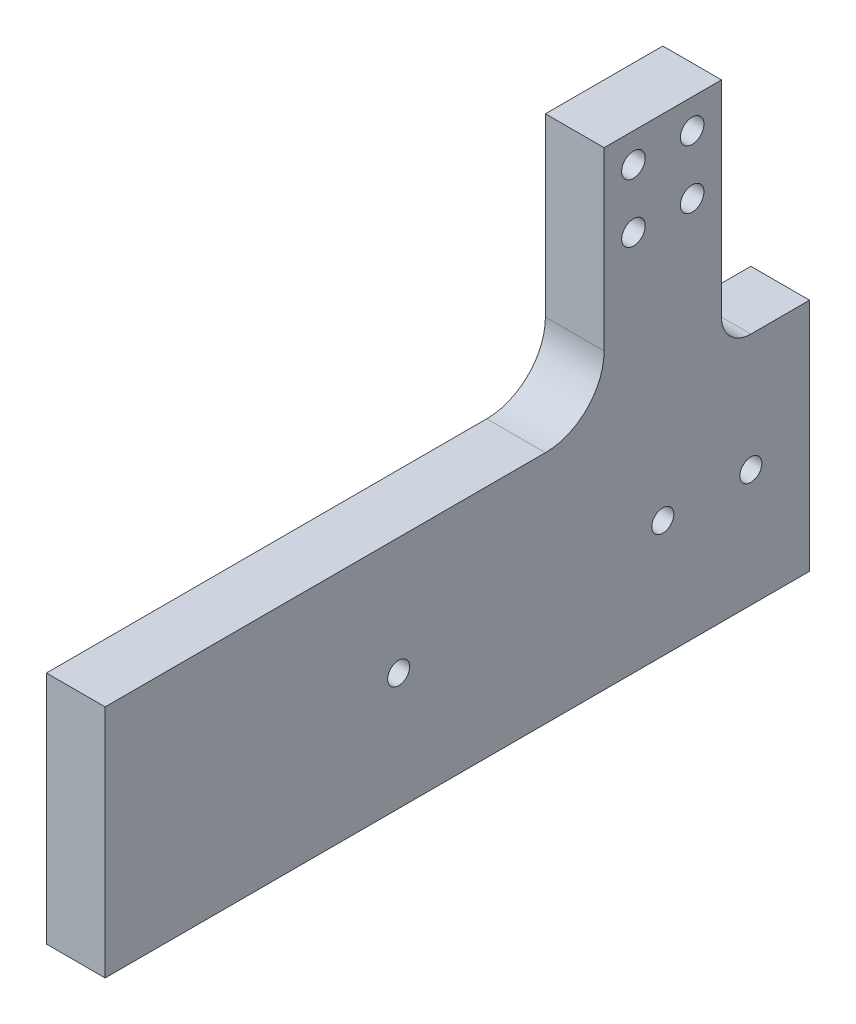
ISO-10303-21;
HEADER;
FILE_DESCRIPTION(('STEP AP214'),'2;1');
FILE_NAME('part.step','',(''),(''),'','','');
FILE_SCHEMA(('AUTOMOTIVE_DESIGN { 1 0 10303 214 1 1 1 1 }'));
ENDSEC;
DATA;
#1=APPLICATION_CONTEXT('core data for automotive mechanical design processes');
#2=APPLICATION_PROTOCOL_DEFINITION('international standard','automotive_design',2000,#1);
#3=PRODUCT_CONTEXT('',#1,'mechanical');
#4=PRODUCT('Part','Part','',(#3));
#5=PRODUCT_RELATED_PRODUCT_CATEGORY('part','',(#4));
#6=PRODUCT_DEFINITION_FORMATION('','',#4);
#7=PRODUCT_DEFINITION_CONTEXT('part definition',#1,'design');
#8=PRODUCT_DEFINITION('design','',#6,#7);
#9=PRODUCT_DEFINITION_SHAPE('','',#8);
#10=(LENGTH_UNIT() NAMED_UNIT(*) SI_UNIT(.MILLI.,.METRE.));
#11=(NAMED_UNIT(*) PLANE_ANGLE_UNIT() SI_UNIT($,.RADIAN.));
#12=(NAMED_UNIT(*) SI_UNIT($,.STERADIAN.) SOLID_ANGLE_UNIT());
#13=UNCERTAINTY_MEASURE_WITH_UNIT(LENGTH_MEASURE(1.E-05),#10,'distance_accuracy_value','');
#14=(GEOMETRIC_REPRESENTATION_CONTEXT(3) GLOBAL_UNCERTAINTY_ASSIGNED_CONTEXT((#13)) GLOBAL_UNIT_ASSIGNED_CONTEXT((#10,
#11,#12)) REPRESENTATION_CONTEXT('',''));
#15=CARTESIAN_POINT('',(0.,0.,0.));
#16=DIRECTION('',(0.,0.,1.));
#17=DIRECTION('',(1.,0.,0.));
#18=AXIS2_PLACEMENT_3D('',#15,#16,#17);
#19=CARTESIAN_POINT('',(12.7,0.,0.));
#20=DIRECTION('',(1.,0.,0.));
#21=DIRECTION('',(0.,0.,-1.));
#22=AXIS2_PLACEMENT_3D('',#19,#20,#21);
#23=PLANE('',#22);
#24=CARTESIAN_POINT('',(12.7,95.25,38.1));
#25=DIRECTION('',(1.,0.,0.));
#26=DIRECTION('',(0.,0.,-1.));
#27=AXIS2_PLACEMENT_3D('',#24,#25,#26);
#28=CIRCLE('',#27,2.55270000000001);
#29=CARTESIAN_POINT('',(12.7,95.25,35.5473));
#30=VERTEX_POINT('',#29);
#31=EDGE_CURVE('E440',#30,#30,#28,.T.);
#32=ORIENTED_EDGE('',*,*,#31,.F.);
#33=EDGE_LOOP('',(#32));
#34=FACE_BOUND('',#33,.T.);
#35=CARTESIAN_POINT('',(12.7,95.25,25.4));
#36=DIRECTION('',(1.,0.,0.));
#37=DIRECTION('',(0.,0.,-1.));
#38=AXIS2_PLACEMENT_3D('',#35,#36,#37);
#39=CIRCLE('',#38,2.55270000000001);
#40=CARTESIAN_POINT('',(12.7,95.25,22.8473));
#41=VERTEX_POINT('',#40);
#42=EDGE_CURVE('E444',#41,#41,#39,.T.);
#43=ORIENTED_EDGE('',*,*,#42,.F.);
#44=EDGE_LOOP('',(#43));
#45=FACE_BOUND('',#44,.T.);
#46=CARTESIAN_POINT('',(12.7,82.55,25.4));
#47=DIRECTION('',(1.,0.,0.));
#48=DIRECTION('',(0.,0.,-1.));
#49=AXIS2_PLACEMENT_3D('',#46,#47,#48);
#50=CIRCLE('',#49,2.55270000000001);
#51=CARTESIAN_POINT('',(12.7,82.55,22.8473));
#52=VERTEX_POINT('',#51);
#53=EDGE_CURVE('E454',#52,#52,#50,.T.);
#54=ORIENTED_EDGE('',*,*,#53,.F.);
#55=EDGE_LOOP('',(#54));
#56=FACE_BOUND('',#55,.T.);
#57=CARTESIAN_POINT('',(12.7,82.55,38.1));
#58=DIRECTION('',(1.,0.,0.));
#59=DIRECTION('',(0.,0.,-1.));
#60=AXIS2_PLACEMENT_3D('',#57,#58,#59);
#61=CIRCLE('',#60,2.55270000000001);
#62=CARTESIAN_POINT('',(12.7,82.55,35.5473));
#63=VERTEX_POINT('',#62);
#64=EDGE_CURVE('E462',#63,#63,#61,.T.);
#65=ORIENTED_EDGE('',*,*,#64,.F.);
#66=EDGE_LOOP('',(#65));
#67=FACE_BOUND('',#66,.T.);
#68=CARTESIAN_POINT('',(12.7,25.4,31.75));
#69=DIRECTION('',(1.,0.,0.));
#70=DIRECTION('',(0.,0.,-1.));
#71=AXIS2_PLACEMENT_3D('',#68,#69,#70);
#72=CIRCLE('',#71,2.38125000000001);
#73=CARTESIAN_POINT('',(12.7,25.4,29.36875));
#74=VERTEX_POINT('',#73);
#75=EDGE_CURVE('E255',#74,#74,#72,.T.);
#76=ORIENTED_EDGE('',*,*,#75,.F.);
#77=EDGE_LOOP('',(#76));
#78=FACE_BOUND('',#77,.T.);
#79=DIRECTION('',(0.,1.,0.));
#80=VECTOR('',#79,1.);
#81=CARTESIAN_POINT('',(12.7,50.8,0.));
#82=LINE('',#81,#80);
#83=CARTESIAN_POINT('',(12.7,0.,0.));
#84=VERTEX_POINT('',#83);
#85=CARTESIAN_POINT('',(12.7,50.8,0.));
#86=VERTEX_POINT('',#85);
#87=EDGE_CURVE('E125',#84,#86,#82,.T.);
#88=ORIENTED_EDGE('',*,*,#87,.T.);
#89=DIRECTION('',(0.,0.,1.));
#90=VECTOR('',#89,1.);
#91=CARTESIAN_POINT('',(12.7,50.8,19.05));
#92=LINE('',#91,#90);
#93=CARTESIAN_POINT('',(12.7,50.8,12.7));
#94=VERTEX_POINT('',#93);
#95=EDGE_CURVE('E115',#86,#94,#92,.T.);
#96=ORIENTED_EDGE('',*,*,#95,.T.);
#97=CARTESIAN_POINT('',(12.7,57.15,12.7));
#98=DIRECTION('',(1.,0.,0.));
#99=DIRECTION('',(0.,0.,-1.));
#100=AXIS2_PLACEMENT_3D('',#97,#98,#99);
#101=CIRCLE('',#100,6.35);
#102=CARTESIAN_POINT('',(12.7,57.15,19.05));
#103=VERTEX_POINT('',#102);
#104=EDGE_CURVE('E11',#94,#103,#101,.F.);
#105=ORIENTED_EDGE('',*,*,#104,.T.);
#106=DIRECTION('',(0.,1.,0.));
#107=VECTOR('',#106,1.);
#108=CARTESIAN_POINT('',(12.7,101.6,19.05));
#109=LINE('',#108,#107);
#110=CARTESIAN_POINT('',(12.7,101.6,19.05));
#111=VERTEX_POINT('',#110);
#112=EDGE_CURVE('E124',#103,#111,#109,.T.);
#113=ORIENTED_EDGE('',*,*,#112,.T.);
#114=DIRECTION('',(0.,0.,1.));
#115=VECTOR('',#114,1.);
#116=CARTESIAN_POINT('',(12.7,101.6,19.05));
#117=LINE('',#116,#115);
#118=CARTESIAN_POINT('',(12.7,101.6,44.45));
#119=VERTEX_POINT('',#118);
#120=EDGE_CURVE('E240',#111,#119,#117,.T.);
#121=ORIENTED_EDGE('',*,*,#120,.T.);
#122=DIRECTION('',(0.,-1.,0.));
#123=VECTOR('',#122,1.);
#124=CARTESIAN_POINT('',(12.7,101.6,44.45));
#125=LINE('',#124,#123);
#126=CARTESIAN_POINT('',(12.7,63.5,44.45));
#127=VERTEX_POINT('',#126);
#128=EDGE_CURVE('E219',#119,#127,#125,.T.);
#129=ORIENTED_EDGE('',*,*,#128,.T.);
#130=CARTESIAN_POINT('',(12.7,63.5,57.15));
#131=DIRECTION('',(1.,0.,0.));
#132=DIRECTION('',(0.,0.,-1.));
#133=AXIS2_PLACEMENT_3D('',#130,#131,#132);
#134=CIRCLE('',#133,12.7);
#135=CARTESIAN_POINT('',(12.7,50.8,57.15));
#136=VERTEX_POINT('',#135);
#137=EDGE_CURVE('E159',#127,#136,#134,.F.);
#138=ORIENTED_EDGE('',*,*,#137,.T.);
#139=DIRECTION('',(0.,0.,1.));
#140=VECTOR('',#139,1.);
#141=CARTESIAN_POINT('',(12.7,50.8,44.45));
#142=LINE('',#141,#140);
#143=CARTESIAN_POINT('',(12.7,50.8,152.4));
#144=VERTEX_POINT('',#143);
#145=EDGE_CURVE('E232',#136,#144,#142,.T.);
#146=ORIENTED_EDGE('',*,*,#145,.T.);
#147=DIRECTION('',(0.,-1.,0.));
#148=VECTOR('',#147,1.);
#149=CARTESIAN_POINT('',(12.7,50.8,152.4));
#150=LINE('',#149,#148);
#151=CARTESIAN_POINT('',(12.7,0.,152.4));
#152=VERTEX_POINT('',#151);
#153=EDGE_CURVE('E235',#144,#152,#150,.T.);
#154=ORIENTED_EDGE('',*,*,#153,.T.);
#155=DIRECTION('',(0.,0.,-1.));
#156=VECTOR('',#155,1.);
#157=CARTESIAN_POINT('',(12.7,0.,152.4));
#158=LINE('',#157,#156);
#159=EDGE_CURVE('E130',#152,#84,#158,.T.);
#160=ORIENTED_EDGE('',*,*,#159,.T.);
#161=EDGE_LOOP('',(#88,#96,#105,#113,#121,#129,#138,#146,#154,#160));
#162=FACE_BOUND('',#161,.T.);
#163=CARTESIAN_POINT('',(12.7,25.4,88.9));
#164=DIRECTION('',(1.,0.,0.));
#165=DIRECTION('',(0.,0.,-1.));
#166=AXIS2_PLACEMENT_3D('',#163,#164,#165);
#167=CIRCLE('',#166,2.38125000000001);
#168=CARTESIAN_POINT('',(12.7,25.4,86.51875));
#169=VERTEX_POINT('',#168);
#170=EDGE_CURVE('E246',#169,#169,#167,.T.);
#171=ORIENTED_EDGE('',*,*,#170,.F.);
#172=EDGE_LOOP('',(#171));
#173=FACE_BOUND('',#172,.T.);
#174=CARTESIAN_POINT('',(12.7,25.4,12.7));
#175=DIRECTION('',(1.,0.,0.));
#176=DIRECTION('',(0.,0.,-1.));
#177=AXIS2_PLACEMENT_3D('',#174,#175,#176);
#178=CIRCLE('',#177,2.38125000000001);
#179=CARTESIAN_POINT('',(12.7,25.4,10.31875));
#180=VERTEX_POINT('',#179);
#181=EDGE_CURVE('E471',#180,#180,#178,.T.);
#182=ORIENTED_EDGE('',*,*,#181,.F.);
#183=EDGE_LOOP('',(#182));
#184=FACE_BOUND('',#183,.T.);
#185=ADVANCED_FACE('F41',(#34,#45,#56,#67,#78,#162,#173,#184),#23,.T.);
#186=CARTESIAN_POINT('',(0.,0.,0.));
#187=DIRECTION('',(1.,0.,0.));
#188=DIRECTION('',(0.,0.,-1.));
#189=AXIS2_PLACEMENT_3D('',#186,#187,#188);
#190=PLANE('',#189);
#191=CARTESIAN_POINT('',(0.,95.25,38.1));
#192=DIRECTION('',(1.,0.,0.));
#193=DIRECTION('',(0.,0.,-1.));
#194=AXIS2_PLACEMENT_3D('',#191,#192,#193);
#195=CIRCLE('',#194,2.55269999999999);
#196=CARTESIAN_POINT('',(0.,95.25,35.5473));
#197=VERTEX_POINT('',#196);
#198=EDGE_CURVE('E438',#197,#197,#195,.T.);
#199=ORIENTED_EDGE('',*,*,#198,.T.);
#200=EDGE_LOOP('',(#199));
#201=FACE_BOUND('',#200,.T.);
#202=CARTESIAN_POINT('',(0.,95.25,25.4));
#203=DIRECTION('',(1.,0.,0.));
#204=DIRECTION('',(0.,0.,-1.));
#205=AXIS2_PLACEMENT_3D('',#202,#203,#204);
#206=CIRCLE('',#205,2.55269999999999);
#207=CARTESIAN_POINT('',(0.,95.25,22.8473));
#208=VERTEX_POINT('',#207);
#209=EDGE_CURVE('E450',#208,#208,#206,.T.);
#210=ORIENTED_EDGE('',*,*,#209,.T.);
#211=EDGE_LOOP('',(#210));
#212=FACE_BOUND('',#211,.T.);
#213=CARTESIAN_POINT('',(0.,82.55,25.4));
#214=DIRECTION('',(1.,0.,0.));
#215=DIRECTION('',(0.,0.,-1.));
#216=AXIS2_PLACEMENT_3D('',#213,#214,#215);
#217=CIRCLE('',#216,2.55269999999999);
#218=CARTESIAN_POINT('',(0.,82.55,22.8473));
#219=VERTEX_POINT('',#218);
#220=EDGE_CURVE('E458',#219,#219,#217,.T.);
#221=ORIENTED_EDGE('',*,*,#220,.T.);
#222=EDGE_LOOP('',(#221));
#223=FACE_BOUND('',#222,.T.);
#224=CARTESIAN_POINT('',(0.,82.55,38.1));
#225=DIRECTION('',(1.,0.,0.));
#226=DIRECTION('',(0.,0.,-1.));
#227=AXIS2_PLACEMENT_3D('',#224,#225,#226);
#228=CIRCLE('',#227,2.55269999999999);
#229=CARTESIAN_POINT('',(0.,82.55,35.5473));
#230=VERTEX_POINT('',#229);
#231=EDGE_CURVE('E466',#230,#230,#228,.T.);
#232=ORIENTED_EDGE('',*,*,#231,.T.);
#233=EDGE_LOOP('',(#232));
#234=FACE_BOUND('',#233,.T.);
#235=DIRECTION('',(0.,1.,0.));
#236=VECTOR('',#235,1.);
#237=CARTESIAN_POINT('',(0.,50.8,0.));
#238=LINE('',#237,#236);
#239=CARTESIAN_POINT('',(0.,0.,0.));
#240=VERTEX_POINT('',#239);
#241=CARTESIAN_POINT('',(0.,50.8,0.));
#242=VERTEX_POINT('',#241);
#243=EDGE_CURVE('E139',#240,#242,#238,.T.);
#244=ORIENTED_EDGE('',*,*,#243,.F.);
#245=DIRECTION('',(0.,0.,-1.));
#246=VECTOR('',#245,1.);
#247=CARTESIAN_POINT('',(0.,0.,152.4));
#248=LINE('',#247,#246);
#249=CARTESIAN_POINT('',(0.,0.,152.4));
#250=VERTEX_POINT('',#249);
#251=EDGE_CURVE('E135',#250,#240,#248,.T.);
#252=ORIENTED_EDGE('',*,*,#251,.F.);
#253=DIRECTION('',(0.,-1.,0.));
#254=VECTOR('',#253,1.);
#255=CARTESIAN_POINT('',(0.,50.8,152.4));
#256=LINE('',#255,#254);
#257=CARTESIAN_POINT('',(0.,50.8,152.4));
#258=VERTEX_POINT('',#257);
#259=EDGE_CURVE('E196',#258,#250,#256,.T.);
#260=ORIENTED_EDGE('',*,*,#259,.F.);
#261=DIRECTION('',(0.,0.,1.));
#262=VECTOR('',#261,1.);
#263=CARTESIAN_POINT('',(0.,50.8,44.45));
#264=LINE('',#263,#262);
#265=CARTESIAN_POINT('',(0.,50.8,57.15));
#266=VERTEX_POINT('',#265);
#267=EDGE_CURVE('E193',#266,#258,#264,.T.);
#268=ORIENTED_EDGE('',*,*,#267,.F.);
#269=CARTESIAN_POINT('',(0.,63.5,57.15));
#270=DIRECTION('',(1.,0.,0.));
#271=DIRECTION('',(0.,0.,-1.));
#272=AXIS2_PLACEMENT_3D('',#269,#270,#271);
#273=CIRCLE('',#272,12.7);
#274=CARTESIAN_POINT('',(0.,63.5,44.45));
#275=VERTEX_POINT('',#274);
#276=EDGE_CURVE('E156',#266,#275,#273,.T.);
#277=ORIENTED_EDGE('',*,*,#276,.T.);
#278=DIRECTION('',(0.,-1.,0.));
#279=VECTOR('',#278,1.);
#280=CARTESIAN_POINT('',(0.,101.6,44.45));
#281=LINE('',#280,#279);
#282=CARTESIAN_POINT('',(0.,101.6,44.45));
#283=VERTEX_POINT('',#282);
#284=EDGE_CURVE('E185',#283,#275,#281,.T.);
#285=ORIENTED_EDGE('',*,*,#284,.F.);
#286=DIRECTION('',(0.,0.,1.));
#287=VECTOR('',#286,1.);
#288=CARTESIAN_POINT('',(0.,101.6,19.05));
#289=LINE('',#288,#287);
#290=CARTESIAN_POINT('',(0.,101.6,19.05));
#291=VERTEX_POINT('',#290);
#292=EDGE_CURVE('E179',#291,#283,#289,.T.);
#293=ORIENTED_EDGE('',*,*,#292,.F.);
#294=DIRECTION('',(0.,1.,0.));
#295=VECTOR('',#294,1.);
#296=CARTESIAN_POINT('',(0.,101.6,19.05));
#297=LINE('',#296,#295);
#298=CARTESIAN_POINT('',(0.,57.15,19.05));
#299=VERTEX_POINT('',#298);
#300=EDGE_CURVE('E173',#299,#291,#297,.T.);
#301=ORIENTED_EDGE('',*,*,#300,.F.);
#302=CARTESIAN_POINT('',(0.,57.15,12.7));
#303=DIRECTION('',(1.,0.,0.));
#304=DIRECTION('',(0.,0.,-1.));
#305=AXIS2_PLACEMENT_3D('',#302,#303,#304);
#306=CIRCLE('',#305,6.35);
#307=CARTESIAN_POINT('',(0.,50.8,12.7));
#308=VERTEX_POINT('',#307);
#309=EDGE_CURVE('E50',#299,#308,#306,.T.);
#310=ORIENTED_EDGE('',*,*,#309,.T.);
#311=DIRECTION('',(0.,0.,1.));
#312=VECTOR('',#311,1.);
#313=CARTESIAN_POINT('',(0.,50.8,19.05));
#314=LINE('',#313,#312);
#315=EDGE_CURVE('E181',#242,#308,#314,.T.);
#316=ORIENTED_EDGE('',*,*,#315,.F.);
#317=EDGE_LOOP('',(#244,#252,#260,#268,#277,#285,#293,#301,#310,#316));
#318=FACE_BOUND('',#317,.T.);
#319=CARTESIAN_POINT('',(0.,25.4,88.9));
#320=DIRECTION('',(1.,0.,0.));
#321=DIRECTION('',(0.,0.,-1.));
#322=AXIS2_PLACEMENT_3D('',#319,#320,#321);
#323=CIRCLE('',#322,2.38125000000001);
#324=CARTESIAN_POINT('',(0.,25.4,86.51875));
#325=VERTEX_POINT('',#324);
#326=EDGE_CURVE('E249',#325,#325,#323,.T.);
#327=ORIENTED_EDGE('',*,*,#326,.T.);
#328=EDGE_LOOP('',(#327));
#329=FACE_BOUND('',#328,.T.);
#330=CARTESIAN_POINT('',(0.,25.4,31.75));
#331=DIRECTION('',(1.,0.,0.));
#332=DIRECTION('',(0.,0.,-1.));
#333=AXIS2_PLACEMENT_3D('',#330,#331,#332);
#334=CIRCLE('',#333,2.38125000000001);
#335=CARTESIAN_POINT('',(0.,25.4,29.36875));
#336=VERTEX_POINT('',#335);
#337=EDGE_CURVE('E258',#336,#336,#334,.T.);
#338=ORIENTED_EDGE('',*,*,#337,.T.);
#339=EDGE_LOOP('',(#338));
#340=FACE_BOUND('',#339,.T.);
#341=CARTESIAN_POINT('',(0.,25.4,12.7));
#342=DIRECTION('',(1.,0.,0.));
#343=DIRECTION('',(0.,0.,-1.));
#344=AXIS2_PLACEMENT_3D('',#341,#342,#343);
#345=CIRCLE('',#344,2.38125000000001);
#346=CARTESIAN_POINT('',(0.,25.4,10.31875));
#347=VERTEX_POINT('',#346);
#348=EDGE_CURVE('E470',#347,#347,#345,.T.);
#349=ORIENTED_EDGE('',*,*,#348,.T.);
#350=EDGE_LOOP('',(#349));
#351=FACE_BOUND('',#350,.T.);
#352=ADVANCED_FACE('F176',(#201,#212,#223,#234,#318,#329,#340,#351),#190,.F.);
#353=CARTESIAN_POINT('',(12.7,50.8,0.));
#354=DIRECTION('',(0.,0.,1.));
#355=DIRECTION('',(1.,0.,0.));
#356=AXIS2_PLACEMENT_3D('',#353,#354,#355);
#357=PLANE('',#356);
#358=ORIENTED_EDGE('',*,*,#243,.T.);
#359=DIRECTION('',(-1.,0.,0.));
#360=VECTOR('',#359,1.);
#361=CARTESIAN_POINT('',(12.7,50.8,0.));
#362=LINE('',#361,#360);
#363=EDGE_CURVE('E119',#86,#242,#362,.T.);
#364=ORIENTED_EDGE('',*,*,#363,.F.);
#365=ORIENTED_EDGE('',*,*,#87,.F.);
#366=DIRECTION('',(-1.,0.,0.));
#367=VECTOR('',#366,1.);
#368=CARTESIAN_POINT('',(12.7,0.,0.));
#369=LINE('',#368,#367);
#370=EDGE_CURVE('E201',#84,#240,#369,.T.);
#371=ORIENTED_EDGE('',*,*,#370,.T.);
#372=EDGE_LOOP('',(#358,#364,#365,#371));
#373=FACE_BOUND('',#372,.T.);
#374=ADVANCED_FACE('F137',(#373),#357,.F.);
#375=CARTESIAN_POINT('',(12.7,50.8,19.05));
#376=DIRECTION('',(0.,-1.,0.));
#377=DIRECTION('',(0.,0.,-1.));
#378=AXIS2_PLACEMENT_3D('',#375,#376,#377);
#379=PLANE('',#378);
#380=ORIENTED_EDGE('',*,*,#315,.T.);
#381=DIRECTION('',(-1.,0.,0.));
#382=VECTOR('',#381,1.);
#383=CARTESIAN_POINT('',(12.7,50.8,12.7));
#384=LINE('',#383,#382);
#385=EDGE_CURVE('E57',#308,#94,#384,.F.);
#386=ORIENTED_EDGE('',*,*,#385,.T.);
#387=ORIENTED_EDGE('',*,*,#95,.F.);
#388=ORIENTED_EDGE('',*,*,#363,.T.);
#389=EDGE_LOOP('',(#380,#386,#387,#388));
#390=FACE_BOUND('',#389,.T.);
#391=ADVANCED_FACE('F117',(#390),#379,.F.);
#392=CARTESIAN_POINT('',(12.7,101.6,19.05));
#393=DIRECTION('',(0.,0.,1.));
#394=DIRECTION('',(0.,-1.,0.));
#395=AXIS2_PLACEMENT_3D('',#392,#393,#394);
#396=PLANE('',#395);
#397=ORIENTED_EDGE('',*,*,#112,.F.);
#398=DIRECTION('',(-1.,0.,0.));
#399=VECTOR('',#398,1.);
#400=CARTESIAN_POINT('',(0.,57.15,19.05));
#401=LINE('',#400,#399);
#402=EDGE_CURVE('E162',#103,#299,#401,.T.);
#403=ORIENTED_EDGE('',*,*,#402,.T.);
#404=ORIENTED_EDGE('',*,*,#300,.T.);
#405=DIRECTION('',(-1.,0.,0.));
#406=VECTOR('',#405,1.);
#407=CARTESIAN_POINT('',(12.7,101.6,19.05));
#408=LINE('',#407,#406);
#409=EDGE_CURVE('E142',#111,#291,#408,.T.);
#410=ORIENTED_EDGE('',*,*,#409,.F.);
#411=EDGE_LOOP('',(#397,#403,#404,#410));
#412=FACE_BOUND('',#411,.T.);
#413=ADVANCED_FACE('F171',(#412),#396,.F.);
#414=CARTESIAN_POINT('',(12.7,101.6,19.05));
#415=DIRECTION('',(0.,-1.,0.));
#416=DIRECTION('',(0.,0.,-1.));
#417=AXIS2_PLACEMENT_3D('',#414,#415,#416);
#418=PLANE('',#417);
#419=ORIENTED_EDGE('',*,*,#292,.T.);
#420=DIRECTION('',(-1.,0.,0.));
#421=VECTOR('',#420,1.);
#422=CARTESIAN_POINT('',(12.7,101.6,44.45));
#423=LINE('',#422,#421);
#424=EDGE_CURVE('E150',#119,#283,#423,.T.);
#425=ORIENTED_EDGE('',*,*,#424,.F.);
#426=ORIENTED_EDGE('',*,*,#120,.F.);
#427=ORIENTED_EDGE('',*,*,#409,.T.);
#428=EDGE_LOOP('',(#419,#425,#426,#427));
#429=FACE_BOUND('',#428,.T.);
#430=ADVANCED_FACE('F263',(#429),#418,.F.);
#431=CARTESIAN_POINT('',(12.7,101.6,44.45));
#432=DIRECTION('',(0.,0.,-1.));
#433=DIRECTION('',(-1.,0.,0.));
#434=AXIS2_PLACEMENT_3D('',#431,#432,#433);
#435=PLANE('',#434);
#436=ORIENTED_EDGE('',*,*,#284,.T.);
#437=DIRECTION('',(-1.,0.,0.));
#438=VECTOR('',#437,1.);
#439=CARTESIAN_POINT('',(12.7,63.5,44.45));
#440=LINE('',#439,#438);
#441=EDGE_CURVE('E147',#275,#127,#440,.F.);
#442=ORIENTED_EDGE('',*,*,#441,.T.);
#443=ORIENTED_EDGE('',*,*,#128,.F.);
#444=ORIENTED_EDGE('',*,*,#424,.T.);
#445=EDGE_LOOP('',(#436,#442,#443,#444));
#446=FACE_BOUND('',#445,.T.);
#447=ADVANCED_FACE('F216',(#446),#435,.F.);
#448=CARTESIAN_POINT('',(12.7,50.8,44.45));
#449=DIRECTION('',(0.,-1.,0.));
#450=DIRECTION('',(0.,0.,-1.));
#451=AXIS2_PLACEMENT_3D('',#448,#449,#450);
#452=PLANE('',#451);
#453=ORIENTED_EDGE('',*,*,#145,.F.);
#454=DIRECTION('',(-1.,0.,0.));
#455=VECTOR('',#454,1.);
#456=CARTESIAN_POINT('',(0.,50.8,57.15));
#457=LINE('',#456,#455);
#458=EDGE_CURVE('E141',#136,#266,#457,.T.);
#459=ORIENTED_EDGE('',*,*,#458,.T.);
#460=ORIENTED_EDGE('',*,*,#267,.T.);
#461=DIRECTION('',(-1.,0.,0.));
#462=VECTOR('',#461,1.);
#463=CARTESIAN_POINT('',(12.7,50.8,152.4));
#464=LINE('',#463,#462);
#465=EDGE_CURVE('E208',#144,#258,#464,.T.);
#466=ORIENTED_EDGE('',*,*,#465,.F.);
#467=EDGE_LOOP('',(#453,#459,#460,#466));
#468=FACE_BOUND('',#467,.T.);
#469=ADVANCED_FACE('F230',(#468),#452,.F.);
#470=CARTESIAN_POINT('',(12.7,50.8,152.4));
#471=DIRECTION('',(0.,0.,-1.));
#472=DIRECTION('',(-1.,0.,0.));
#473=AXIS2_PLACEMENT_3D('',#470,#471,#472);
#474=PLANE('',#473);
#475=ORIENTED_EDGE('',*,*,#259,.T.);
#476=DIRECTION('',(-1.,0.,0.));
#477=VECTOR('',#476,1.);
#478=CARTESIAN_POINT('',(12.7,0.,152.4));
#479=LINE('',#478,#477);
#480=EDGE_CURVE('E204',#152,#250,#479,.T.);
#481=ORIENTED_EDGE('',*,*,#480,.F.);
#482=ORIENTED_EDGE('',*,*,#153,.F.);
#483=ORIENTED_EDGE('',*,*,#465,.T.);
#484=EDGE_LOOP('',(#475,#481,#482,#483));
#485=FACE_BOUND('',#484,.T.);
#486=ADVANCED_FACE('F289',(#485),#474,.F.);
#487=CARTESIAN_POINT('',(12.7,0.,152.4));
#488=DIRECTION('',(0.,1.,0.));
#489=DIRECTION('',(0.,0.,1.));
#490=AXIS2_PLACEMENT_3D('',#487,#488,#489);
#491=PLANE('',#490);
#492=ORIENTED_EDGE('',*,*,#251,.T.);
#493=ORIENTED_EDGE('',*,*,#370,.F.);
#494=ORIENTED_EDGE('',*,*,#159,.F.);
#495=ORIENTED_EDGE('',*,*,#480,.T.);
#496=EDGE_LOOP('',(#492,#493,#494,#495));
#497=FACE_BOUND('',#496,.T.);
#498=ADVANCED_FACE('F286',(#497),#491,.F.);
#499=CARTESIAN_POINT('',(12.7,25.4,88.9));
#500=DIRECTION('',(-1.,0.,0.));
#501=DIRECTION('',(0.,0.,1.));
#502=AXIS2_PLACEMENT_3D('',#499,#500,#501);
#503=CYLINDRICAL_SURFACE('',#502,2.38125000000001);
#504=ORIENTED_EDGE('',*,*,#170,.T.);
#505=EDGE_LOOP('',(#504));
#506=FACE_BOUND('',#505,.T.);
#507=ORIENTED_EDGE('',*,*,#326,.F.);
#508=EDGE_LOOP('',(#507));
#509=FACE_BOUND('',#508,.T.);
#510=ADVANCED_FACE('F283',(#506,#509),#503,.F.);
#511=CARTESIAN_POINT('',(12.7,25.4,31.75));
#512=DIRECTION('',(-1.,0.,0.));
#513=DIRECTION('',(0.,0.,1.));
#514=AXIS2_PLACEMENT_3D('',#511,#512,#513);
#515=CYLINDRICAL_SURFACE('',#514,2.38125000000001);
#516=ORIENTED_EDGE('',*,*,#75,.T.);
#517=EDGE_LOOP('',(#516));
#518=FACE_BOUND('',#517,.T.);
#519=ORIENTED_EDGE('',*,*,#337,.F.);
#520=EDGE_LOOP('',(#519));
#521=FACE_BOUND('',#520,.T.);
#522=ADVANCED_FACE('F314',(#518,#521),#515,.F.);
#523=CARTESIAN_POINT('',(12.7,25.4,12.7));
#524=DIRECTION('',(-1.,0.,0.));
#525=DIRECTION('',(0.,0.,1.));
#526=AXIS2_PLACEMENT_3D('',#523,#524,#525);
#527=CYLINDRICAL_SURFACE('',#526,2.38125000000001);
#528=ORIENTED_EDGE('',*,*,#181,.T.);
#529=EDGE_LOOP('',(#528));
#530=FACE_BOUND('',#529,.T.);
#531=ORIENTED_EDGE('',*,*,#348,.F.);
#532=EDGE_LOOP('',(#531));
#533=FACE_BOUND('',#532,.T.);
#534=ADVANCED_FACE('F320',(#530,#533),#527,.F.);
#535=CARTESIAN_POINT('',(12.7,82.55,38.1));
#536=DIRECTION('',(1.,0.,0.));
#537=DIRECTION('',(0.,0.,-1.));
#538=AXIS2_PLACEMENT_3D('',#535,#536,#537);
#539=CYLINDRICAL_SURFACE('',#538,2.5527);
#540=ORIENTED_EDGE('',*,*,#231,.F.);
#541=EDGE_LOOP('',(#540));
#542=FACE_BOUND('',#541,.T.);
#543=ORIENTED_EDGE('',*,*,#64,.T.);
#544=EDGE_LOOP('',(#543));
#545=FACE_BOUND('',#544,.T.);
#546=ADVANCED_FACE('F327',(#542,#545),#539,.F.);
#547=CARTESIAN_POINT('',(12.7,82.55,25.4));
#548=DIRECTION('',(1.,0.,0.));
#549=DIRECTION('',(0.,0.,-1.));
#550=AXIS2_PLACEMENT_3D('',#547,#548,#549);
#551=CYLINDRICAL_SURFACE('',#550,2.5527);
#552=ORIENTED_EDGE('',*,*,#220,.F.);
#553=EDGE_LOOP('',(#552));
#554=FACE_BOUND('',#553,.T.);
#555=ORIENTED_EDGE('',*,*,#53,.T.);
#556=EDGE_LOOP('',(#555));
#557=FACE_BOUND('',#556,.T.);
#558=ADVANCED_FACE('F335',(#554,#557),#551,.F.);
#559=CARTESIAN_POINT('',(12.7,95.25,25.4));
#560=DIRECTION('',(1.,0.,0.));
#561=DIRECTION('',(0.,0.,-1.));
#562=AXIS2_PLACEMENT_3D('',#559,#560,#561);
#563=CYLINDRICAL_SURFACE('',#562,2.5527);
#564=ORIENTED_EDGE('',*,*,#209,.F.);
#565=EDGE_LOOP('',(#564));
#566=FACE_BOUND('',#565,.T.);
#567=ORIENTED_EDGE('',*,*,#42,.T.);
#568=EDGE_LOOP('',(#567));
#569=FACE_BOUND('',#568,.T.);
#570=ADVANCED_FACE('F343',(#566,#569),#563,.F.);
#571=CARTESIAN_POINT('',(12.7,95.25,38.1));
#572=DIRECTION('',(1.,0.,0.));
#573=DIRECTION('',(0.,0.,-1.));
#574=AXIS2_PLACEMENT_3D('',#571,#572,#573);
#575=CYLINDRICAL_SURFACE('',#574,2.5527);
#576=ORIENTED_EDGE('',*,*,#198,.F.);
#577=EDGE_LOOP('',(#576));
#578=FACE_BOUND('',#577,.T.);
#579=ORIENTED_EDGE('',*,*,#31,.T.);
#580=EDGE_LOOP('',(#579));
#581=FACE_BOUND('',#580,.T.);
#582=ADVANCED_FACE('F351',(#578,#581),#575,.F.);
#583=CARTESIAN_POINT('',(12.7,63.5,57.15));
#584=DIRECTION('',(1.,0.,0.));
#585=DIRECTION('',(0.,0.,-1.));
#586=AXIS2_PLACEMENT_3D('',#583,#584,#585);
#587=CYLINDRICAL_SURFACE('',#586,12.7);
#588=ORIENTED_EDGE('',*,*,#137,.F.);
#589=ORIENTED_EDGE('',*,*,#441,.F.);
#590=ORIENTED_EDGE('',*,*,#276,.F.);
#591=ORIENTED_EDGE('',*,*,#458,.F.);
#592=EDGE_LOOP('',(#588,#589,#590,#591));
#593=FACE_BOUND('',#592,.T.);
#594=ADVANCED_FACE('F227',(#593),#587,.F.);
#595=CARTESIAN_POINT('',(12.7,57.15,12.7));
#596=DIRECTION('',(1.,0.,0.));
#597=DIRECTION('',(0.,0.,-1.));
#598=AXIS2_PLACEMENT_3D('',#595,#596,#597);
#599=CYLINDRICAL_SURFACE('',#598,6.35);
#600=ORIENTED_EDGE('',*,*,#104,.F.);
#601=ORIENTED_EDGE('',*,*,#385,.F.);
#602=ORIENTED_EDGE('',*,*,#309,.F.);
#603=ORIENTED_EDGE('',*,*,#402,.F.);
#604=EDGE_LOOP('',(#600,#601,#602,#603));
#605=FACE_BOUND('',#604,.T.);
#606=ADVANCED_FACE('F43',(#605),#599,.F.);
#607=CLOSED_SHELL('',(#185,#352,#374,#391,#413,#430,#447,#469,#486,#498,#510,#522,#534,#546,
#558,#570,#582,#594,#606));
#608=MANIFOLD_SOLID_BREP('B2',#607);
#609=ADVANCED_BREP_SHAPE_REPRESENTATION('',(#18,#608),#14);
#610=SHAPE_DEFINITION_REPRESENTATION(#9,#609);
ENDSEC;
END-ISO-10303-21;
